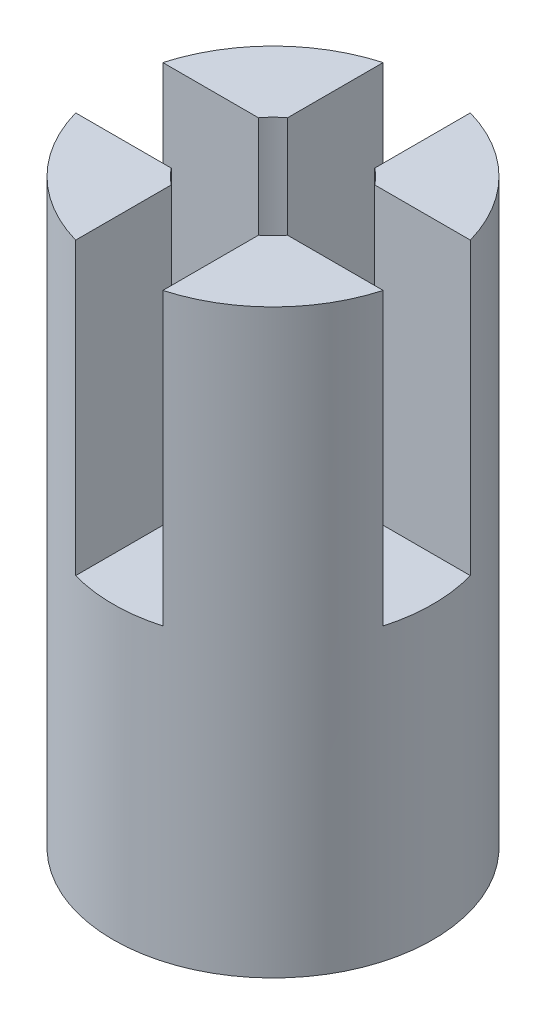
ISO-10303-21;
HEADER;
FILE_DESCRIPTION(('STEP AP214'),'2;1');
FILE_NAME('part.step','',(''),(''),'','','');
FILE_SCHEMA(('AUTOMOTIVE_DESIGN { 1 0 10303 214 1 1 1 1 }'));
ENDSEC;
DATA;
#1=APPLICATION_CONTEXT('core data for automotive mechanical design processes');
#2=APPLICATION_PROTOCOL_DEFINITION('international standard','automotive_design',2000,#1);
#3=PRODUCT_CONTEXT('',#1,'mechanical');
#4=PRODUCT('Part','Part','',(#3));
#5=PRODUCT_RELATED_PRODUCT_CATEGORY('part','',(#4));
#6=PRODUCT_DEFINITION_FORMATION('','',#4);
#7=PRODUCT_DEFINITION_CONTEXT('part definition',#1,'design');
#8=PRODUCT_DEFINITION('design','',#6,#7);
#9=PRODUCT_DEFINITION_SHAPE('','',#8);
#10=(LENGTH_UNIT() NAMED_UNIT(*) SI_UNIT(.MILLI.,.METRE.));
#11=(NAMED_UNIT(*) PLANE_ANGLE_UNIT() SI_UNIT($,.RADIAN.));
#12=(NAMED_UNIT(*) SI_UNIT($,.STERADIAN.) SOLID_ANGLE_UNIT());
#13=UNCERTAINTY_MEASURE_WITH_UNIT(LENGTH_MEASURE(1.E-05),#10,'distance_accuracy_value','');
#14=(GEOMETRIC_REPRESENTATION_CONTEXT(3) GLOBAL_UNCERTAINTY_ASSIGNED_CONTEXT((#13)) GLOBAL_UNIT_ASSIGNED_CONTEXT((#10,
#11,#12)) REPRESENTATION_CONTEXT('',''));
#15=CARTESIAN_POINT('',(0.,0.,0.));
#16=DIRECTION('',(0.,0.,1.));
#17=DIRECTION('',(1.,0.,0.));
#18=AXIS2_PLACEMENT_3D('',#15,#16,#17);
#19=CARTESIAN_POINT('',(0.,20.,0.));
#20=DIRECTION('',(0.,1.,0.));
#21=DIRECTION('',(0.,0.,1.));
#22=AXIS2_PLACEMENT_3D('',#19,#20,#21);
#23=PLANE('',#22);
#24=DIRECTION('',(0.,0.,-1.));
#25=VECTOR('',#24,1.);
#26=CARTESIAN_POINT('',(1.5,20.,-1.5));
#27=LINE('',#26,#25);
#28=CARTESIAN_POINT('',(1.5,20.,-2.));
#29=VERTEX_POINT('',#28);
#30=CARTESIAN_POINT('',(1.5,20.,-5.29150262212918));
#31=VERTEX_POINT('',#30);
#32=EDGE_CURVE('E231',#29,#31,#27,.T.);
#33=ORIENTED_EDGE('',*,*,#32,.F.);
#34=CARTESIAN_POINT('',(0.,20.,0.));
#35=DIRECTION('',(0.,1.,0.));
#36=DIRECTION('',(0.,0.,1.));
#37=AXIS2_PLACEMENT_3D('',#34,#35,#36);
#38=CIRCLE('',#37,2.5);
#39=CARTESIAN_POINT('',(2.,20.,-1.5));
#40=VERTEX_POINT('',#39);
#41=EDGE_CURVE('E279',#40,#29,#38,.T.);
#42=ORIENTED_EDGE('',*,*,#41,.F.);
#43=DIRECTION('',(-1.,0.,0.));
#44=VECTOR('',#43,1.);
#45=CARTESIAN_POINT('',(1.5,20.,-1.5));
#46=LINE('',#45,#44);
#47=CARTESIAN_POINT('',(5.29150262212918,20.,-1.5));
#48=VERTEX_POINT('',#47);
#49=EDGE_CURVE('E255',#48,#40,#46,.T.);
#50=ORIENTED_EDGE('',*,*,#49,.F.);
#51=CARTESIAN_POINT('',(0.,20.,0.));
#52=DIRECTION('',(0.,1.,0.));
#53=DIRECTION('',(0.,0.,1.));
#54=AXIS2_PLACEMENT_3D('',#51,#52,#53);
#55=CIRCLE('',#54,5.5);
#56=EDGE_CURVE('E169',#48,#31,#55,.T.);
#57=ORIENTED_EDGE('',*,*,#56,.T.);
#58=EDGE_LOOP('',(#33,#42,#50,#57));
#59=FACE_BOUND('',#58,.T.);
#60=ADVANCED_FACE('F33',(#59),#23,.T.);
#61=DIRECTION('',(1.,0.,0.));
#62=VECTOR('',#61,1.);
#63=CARTESIAN_POINT('',(1.5,20.,1.5));
#64=LINE('',#63,#62);
#65=CARTESIAN_POINT('',(2.,20.,1.5));
#66=VERTEX_POINT('',#65);
#67=CARTESIAN_POINT('',(5.29150262212918,20.,1.5));
#68=VERTEX_POINT('',#67);
#69=EDGE_CURVE('E253',#66,#68,#64,.T.);
#70=ORIENTED_EDGE('',*,*,#69,.F.);
#71=CARTESIAN_POINT('',(1.5,20.,2.));
#72=VERTEX_POINT('',#71);
#73=EDGE_CURVE('E184',#72,#66,#38,.T.);
#74=ORIENTED_EDGE('',*,*,#73,.F.);
#75=DIRECTION('',(0.,0.,-1.));
#76=VECTOR('',#75,1.);
#77=CARTESIAN_POINT('',(1.5,20.,5.79208174517747));
#78=LINE('',#77,#76);
#79=CARTESIAN_POINT('',(1.5,20.,5.29150262212918));
#80=VERTEX_POINT('',#79);
#81=EDGE_CURVE('E251',#80,#72,#78,.T.);
#82=ORIENTED_EDGE('',*,*,#81,.F.);
#83=EDGE_CURVE('E173',#80,#68,#55,.T.);
#84=ORIENTED_EDGE('',*,*,#83,.T.);
#85=EDGE_LOOP('',(#70,#74,#82,#84));
#86=FACE_BOUND('',#85,.T.);
#87=ADVANCED_FACE('F303',(#86),#23,.T.);
#88=DIRECTION('',(0.,0.,1.));
#89=VECTOR('',#88,1.);
#90=CARTESIAN_POINT('',(-1.5,20.,1.5));
#91=LINE('',#90,#89);
#92=CARTESIAN_POINT('',(-1.5,20.,2.));
#93=VERTEX_POINT('',#92);
#94=CARTESIAN_POINT('',(-1.5,20.,5.29150262212918));
#95=VERTEX_POINT('',#94);
#96=EDGE_CURVE('E249',#93,#95,#91,.T.);
#97=ORIENTED_EDGE('',*,*,#96,.F.);
#98=CARTESIAN_POINT('',(-2.,20.,1.5));
#99=VERTEX_POINT('',#98);
#100=EDGE_CURVE('E280',#99,#93,#38,.T.);
#101=ORIENTED_EDGE('',*,*,#100,.F.);
#102=DIRECTION('',(1.,0.,0.));
#103=VECTOR('',#102,1.);
#104=CARTESIAN_POINT('',(-9.18844745956285,20.,1.5));
#105=LINE('',#104,#103);
#106=CARTESIAN_POINT('',(-5.29150262212918,20.,1.5));
#107=VERTEX_POINT('',#106);
#108=EDGE_CURVE('E247',#107,#99,#105,.T.);
#109=ORIENTED_EDGE('',*,*,#108,.F.);
#110=EDGE_CURVE('E170',#107,#95,#55,.T.);
#111=ORIENTED_EDGE('',*,*,#110,.T.);
#112=EDGE_LOOP('',(#97,#101,#109,#111));
#113=FACE_BOUND('',#112,.T.);
#114=ADVANCED_FACE('F308',(#113),#23,.T.);
#115=DIRECTION('',(-1.,0.,0.));
#116=VECTOR('',#115,1.);
#117=CARTESIAN_POINT('',(-8.80863882053481,20.,-1.5));
#118=LINE('',#117,#116);
#119=CARTESIAN_POINT('',(-2.,20.,-1.5));
#120=VERTEX_POINT('',#119);
#121=CARTESIAN_POINT('',(-5.29150262212918,20.,-1.5));
#122=VERTEX_POINT('',#121);
#123=EDGE_CURVE('E163',#120,#122,#118,.T.);
#124=ORIENTED_EDGE('',*,*,#123,.F.);
#125=CARTESIAN_POINT('',(-1.5,20.,-2.));
#126=VERTEX_POINT('',#125);
#127=EDGE_CURVE('E162',#126,#120,#38,.T.);
#128=ORIENTED_EDGE('',*,*,#127,.F.);
#129=DIRECTION('',(0.,0.,1.));
#130=VECTOR('',#129,1.);
#131=CARTESIAN_POINT('',(-1.5,20.,-5.80668976975561));
#132=LINE('',#131,#130);
#133=CARTESIAN_POINT('',(-1.5,20.,-5.29150262212918));
#134=VERTEX_POINT('',#133);
#135=EDGE_CURVE('E147',#134,#126,#132,.T.);
#136=ORIENTED_EDGE('',*,*,#135,.F.);
#137=EDGE_CURVE('E160',#134,#122,#55,.T.);
#138=ORIENTED_EDGE('',*,*,#137,.T.);
#139=EDGE_LOOP('',(#124,#128,#136,#138));
#140=FACE_BOUND('',#139,.T.);
#141=ADVANCED_FACE('F159',(#140),#23,.T.);
#142=CARTESIAN_POINT('',(0.,0.,0.));
#143=DIRECTION('',(0.,1.,0.));
#144=DIRECTION('',(0.,0.,1.));
#145=AXIS2_PLACEMENT_3D('',#142,#143,#144);
#146=PLANE('',#145);
#147=CARTESIAN_POINT('',(0.,0.,0.));
#148=DIRECTION('',(0.,1.,0.));
#149=DIRECTION('',(0.,0.,1.));
#150=AXIS2_PLACEMENT_3D('',#147,#148,#149);
#151=CIRCLE('',#150,5.5);
#152=CARTESIAN_POINT('',(0.,0.,5.5));
#153=VERTEX_POINT('',#152);
#154=EDGE_CURVE('E175',#153,#153,#151,.T.);
#155=ORIENTED_EDGE('',*,*,#154,.F.);
#156=EDGE_LOOP('',(#155));
#157=FACE_BOUND('',#156,.T.);
#158=CARTESIAN_POINT('',(0.,0.,0.));
#159=DIRECTION('',(0.,1.,0.));
#160=DIRECTION('',(0.,0.,1.));
#161=AXIS2_PLACEMENT_3D('',#158,#159,#160);
#162=CIRCLE('',#161,2.5);
#163=CARTESIAN_POINT('',(0.,0.,2.5));
#164=VERTEX_POINT('',#163);
#165=EDGE_CURVE('E180',#164,#164,#162,.T.);
#166=ORIENTED_EDGE('',*,*,#165,.T.);
#167=EDGE_LOOP('',(#166));
#168=FACE_BOUND('',#167,.T.);
#169=ADVANCED_FACE('F288',(#157,#168),#146,.F.);
#170=CARTESIAN_POINT('',(0.,20.,0.));
#171=DIRECTION('',(0.,-1.,0.));
#172=DIRECTION('',(0.,0.,-1.));
#173=AXIS2_PLACEMENT_3D('',#170,#171,#172);
#174=CYLINDRICAL_SURFACE('',#173,5.5);
#175=ORIENTED_EDGE('',*,*,#56,.F.);
#176=DIRECTION('',(0.,-1.,0.));
#177=VECTOR('',#176,1.);
#178=CARTESIAN_POINT('',(5.29150262212918,20.,-1.5));
#179=LINE('',#178,#177);
#180=CARTESIAN_POINT('',(5.29150262212918,10.,-1.5));
#181=VERTEX_POINT('',#180);
#182=EDGE_CURVE('E273',#48,#181,#179,.T.);
#183=ORIENTED_EDGE('',*,*,#182,.T.);
#184=CARTESIAN_POINT('',(0.,10.,0.));
#185=DIRECTION('',(0.,1.,0.));
#186=DIRECTION('',(0.,0.,1.));
#187=AXIS2_PLACEMENT_3D('',#184,#185,#186);
#188=CIRCLE('',#187,5.5);
#189=CARTESIAN_POINT('',(5.29150262212918,10.,1.5));
#190=VERTEX_POINT('',#189);
#191=EDGE_CURVE('E153',#190,#181,#188,.T.);
#192=ORIENTED_EDGE('',*,*,#191,.F.);
#193=DIRECTION('',(0.,-1.,0.));
#194=VECTOR('',#193,1.);
#195=CARTESIAN_POINT('',(5.29150262212918,20.,1.5));
#196=LINE('',#195,#194);
#197=EDGE_CURVE('E270',#190,#68,#196,.F.);
#198=ORIENTED_EDGE('',*,*,#197,.T.);
#199=ORIENTED_EDGE('',*,*,#83,.F.);
#200=DIRECTION('',(0.,-1.,0.));
#201=VECTOR('',#200,1.);
#202=CARTESIAN_POINT('',(1.5,20.,5.29150262212918));
#203=LINE('',#202,#201);
#204=CARTESIAN_POINT('',(1.5,10.,5.29150262212918));
#205=VERTEX_POINT('',#204);
#206=EDGE_CURVE('E267',#80,#205,#203,.T.);
#207=ORIENTED_EDGE('',*,*,#206,.T.);
#208=CARTESIAN_POINT('',(-1.5,10.,5.29150262212918));
#209=VERTEX_POINT('',#208);
#210=EDGE_CURVE('E244',#209,#205,#188,.T.);
#211=ORIENTED_EDGE('',*,*,#210,.F.);
#212=DIRECTION('',(0.,-1.,0.));
#213=VECTOR('',#212,1.);
#214=CARTESIAN_POINT('',(-1.5,20.,5.29150262212918));
#215=LINE('',#214,#213);
#216=EDGE_CURVE('E264',#209,#95,#215,.F.);
#217=ORIENTED_EDGE('',*,*,#216,.T.);
#218=ORIENTED_EDGE('',*,*,#110,.F.);
#219=DIRECTION('',(0.,-1.,0.));
#220=VECTOR('',#219,1.);
#221=CARTESIAN_POINT('',(-5.29150262212918,20.,1.5));
#222=LINE('',#221,#220);
#223=CARTESIAN_POINT('',(-5.29150262212918,10.,1.5));
#224=VERTEX_POINT('',#223);
#225=EDGE_CURVE('E261',#107,#224,#222,.T.);
#226=ORIENTED_EDGE('',*,*,#225,.T.);
#227=CARTESIAN_POINT('',(-5.29150262212918,10.,-1.5));
#228=VERTEX_POINT('',#227);
#229=EDGE_CURVE('E258',#228,#224,#188,.T.);
#230=ORIENTED_EDGE('',*,*,#229,.F.);
#231=DIRECTION('',(0.,-1.,0.));
#232=VECTOR('',#231,1.);
#233=CARTESIAN_POINT('',(-5.29150262212918,20.,-1.5));
#234=LINE('',#233,#232);
#235=EDGE_CURVE('E152',#228,#122,#234,.F.);
#236=ORIENTED_EDGE('',*,*,#235,.T.);
#237=ORIENTED_EDGE('',*,*,#137,.F.);
#238=DIRECTION('',(0.,-1.,0.));
#239=VECTOR('',#238,1.);
#240=CARTESIAN_POINT('',(-1.5,20.,-5.29150262212918));
#241=LINE('',#240,#239);
#242=CARTESIAN_POINT('',(-1.5,10.,-5.29150262212918));
#243=VERTEX_POINT('',#242);
#244=EDGE_CURVE('E144',#134,#243,#241,.T.);
#245=ORIENTED_EDGE('',*,*,#244,.T.);
#246=CARTESIAN_POINT('',(1.5,10.,-5.29150262212918));
#247=VERTEX_POINT('',#246);
#248=EDGE_CURVE('E333',#247,#243,#188,.T.);
#249=ORIENTED_EDGE('',*,*,#248,.F.);
#250=DIRECTION('',(0.,-1.,0.));
#251=VECTOR('',#250,1.);
#252=CARTESIAN_POINT('',(1.5,20.,-5.29150262212918));
#253=LINE('',#252,#251);
#254=EDGE_CURVE('E276',#247,#31,#253,.F.);
#255=ORIENTED_EDGE('',*,*,#254,.T.);
#256=EDGE_LOOP('',(#175,#183,#192,#198,#199,#207,#211,#217,#218,#226,#230,#236,#237,#245,#249,#255));
#257=FACE_BOUND('',#256,.T.);
#258=ORIENTED_EDGE('',*,*,#154,.T.);
#259=EDGE_LOOP('',(#258));
#260=FACE_BOUND('',#259,.T.);
#261=ADVANCED_FACE('F35',(#257,#260),#174,.T.);
#262=CARTESIAN_POINT('',(0.,20.,0.));
#263=DIRECTION('',(0.,-1.,0.));
#264=DIRECTION('',(0.,0.,-1.));
#265=AXIS2_PLACEMENT_3D('',#262,#263,#264);
#266=CYLINDRICAL_SURFACE('',#265,2.5);
#267=DIRECTION('',(0.,-1.,0.));
#268=VECTOR('',#267,1.);
#269=CARTESIAN_POINT('',(2.,20.,-1.5));
#270=LINE('',#269,#268);
#271=CARTESIAN_POINT('',(2.,10.,-1.5));
#272=VERTEX_POINT('',#271);
#273=EDGE_CURVE('E11',#40,#272,#270,.T.);
#274=ORIENTED_EDGE('',*,*,#273,.F.);
#275=ORIENTED_EDGE('',*,*,#41,.T.);
#276=DIRECTION('',(0.,-1.,0.));
#277=VECTOR('',#276,1.);
#278=CARTESIAN_POINT('',(1.5,20.,-2.));
#279=LINE('',#278,#277);
#280=CARTESIAN_POINT('',(1.5,10.,-2.));
#281=VERTEX_POINT('',#280);
#282=EDGE_CURVE('E202',#281,#29,#279,.F.);
#283=ORIENTED_EDGE('',*,*,#282,.F.);
#284=CARTESIAN_POINT('',(0.,10.,0.));
#285=DIRECTION('',(0.,1.,0.));
#286=DIRECTION('',(0.,0.,1.));
#287=AXIS2_PLACEMENT_3D('',#284,#285,#286);
#288=CIRCLE('',#287,2.5);
#289=CARTESIAN_POINT('',(-1.5,10.,-2.));
#290=VERTEX_POINT('',#289);
#291=EDGE_CURVE('E199',#281,#290,#288,.T.);
#292=ORIENTED_EDGE('',*,*,#291,.T.);
#293=DIRECTION('',(0.,-1.,0.));
#294=VECTOR('',#293,1.);
#295=CARTESIAN_POINT('',(-1.5,20.,-2.));
#296=LINE('',#295,#294);
#297=EDGE_CURVE('E200',#126,#290,#296,.T.);
#298=ORIENTED_EDGE('',*,*,#297,.F.);
#299=ORIENTED_EDGE('',*,*,#127,.T.);
#300=DIRECTION('',(0.,-1.,0.));
#301=VECTOR('',#300,1.);
#302=CARTESIAN_POINT('',(-2.,20.,-1.5));
#303=LINE('',#302,#301);
#304=CARTESIAN_POINT('',(-2.,10.,-1.5));
#305=VERTEX_POINT('',#304);
#306=EDGE_CURVE('E194',#305,#120,#303,.F.);
#307=ORIENTED_EDGE('',*,*,#306,.F.);
#308=CARTESIAN_POINT('',(-2.,10.,1.5));
#309=VERTEX_POINT('',#308);
#310=EDGE_CURVE('E189',#305,#309,#288,.T.);
#311=ORIENTED_EDGE('',*,*,#310,.T.);
#312=DIRECTION('',(0.,-1.,0.));
#313=VECTOR('',#312,1.);
#314=CARTESIAN_POINT('',(-2.,20.,1.5));
#315=LINE('',#314,#313);
#316=EDGE_CURVE('E196',#99,#309,#315,.T.);
#317=ORIENTED_EDGE('',*,*,#316,.F.);
#318=ORIENTED_EDGE('',*,*,#100,.T.);
#319=DIRECTION('',(0.,-1.,0.));
#320=VECTOR('',#319,1.);
#321=CARTESIAN_POINT('',(-1.5,20.,2.));
#322=LINE('',#321,#320);
#323=CARTESIAN_POINT('',(-1.5,10.,2.));
#324=VERTEX_POINT('',#323);
#325=EDGE_CURVE('E187',#324,#93,#322,.F.);
#326=ORIENTED_EDGE('',*,*,#325,.F.);
#327=CARTESIAN_POINT('',(1.5,10.,2.));
#328=VERTEX_POINT('',#327);
#329=EDGE_CURVE('E179',#324,#328,#288,.T.);
#330=ORIENTED_EDGE('',*,*,#329,.T.);
#331=DIRECTION('',(0.,-1.,0.));
#332=VECTOR('',#331,1.);
#333=CARTESIAN_POINT('',(1.5,20.,2.));
#334=LINE('',#333,#332);
#335=EDGE_CURVE('E191',#72,#328,#334,.T.);
#336=ORIENTED_EDGE('',*,*,#335,.F.);
#337=ORIENTED_EDGE('',*,*,#73,.T.);
#338=DIRECTION('',(0.,-1.,0.));
#339=VECTOR('',#338,1.);
#340=CARTESIAN_POINT('',(2.,20.,1.5));
#341=LINE('',#340,#339);
#342=CARTESIAN_POINT('',(2.,10.,1.5));
#343=VERTEX_POINT('',#342);
#344=EDGE_CURVE('E41',#343,#66,#341,.F.);
#345=ORIENTED_EDGE('',*,*,#344,.F.);
#346=EDGE_CURVE('E188',#343,#272,#288,.T.);
#347=ORIENTED_EDGE('',*,*,#346,.T.);
#348=EDGE_LOOP('',(#274,#275,#283,#292,#298,#299,#307,#311,#317,#318,#326,#330,#336,#337,#345,#347));
#349=FACE_BOUND('',#348,.T.);
#350=ORIENTED_EDGE('',*,*,#165,.F.);
#351=EDGE_LOOP('',(#350));
#352=FACE_BOUND('',#351,.T.);
#353=ADVANCED_FACE('F215',(#349,#352),#266,.F.);
#354=CARTESIAN_POINT('',(0.,10.,0.));
#355=DIRECTION('',(0.,1.,0.));
#356=DIRECTION('',(0.,0.,1.));
#357=AXIS2_PLACEMENT_3D('',#354,#355,#356);
#358=PLANE('',#357);
#359=ORIENTED_EDGE('',*,*,#210,.T.);
#360=DIRECTION('',(0.,0.,-1.));
#361=VECTOR('',#360,1.);
#362=CARTESIAN_POINT('',(1.5,10.,5.79208174517747));
#363=LINE('',#362,#361);
#364=EDGE_CURVE('E236',#205,#328,#363,.T.);
#365=ORIENTED_EDGE('',*,*,#364,.T.);
#366=ORIENTED_EDGE('',*,*,#329,.F.);
#367=DIRECTION('',(0.,0.,1.));
#368=VECTOR('',#367,1.);
#369=CARTESIAN_POINT('',(-1.5,10.,1.5));
#370=LINE('',#369,#368);
#371=EDGE_CURVE('E229',#324,#209,#370,.T.);
#372=ORIENTED_EDGE('',*,*,#371,.T.);
#373=EDGE_LOOP('',(#359,#365,#366,#372));
#374=FACE_BOUND('',#373,.T.);
#375=ADVANCED_FACE('F290',(#374),#358,.T.);
#376=CARTESIAN_POINT('',(-1.5,10.,1.5));
#377=DIRECTION('',(-1.,0.,0.));
#378=DIRECTION('',(0.,0.,1.));
#379=AXIS2_PLACEMENT_3D('',#376,#377,#378);
#380=PLANE('',#379);
#381=ORIENTED_EDGE('',*,*,#371,.F.);
#382=ORIENTED_EDGE('',*,*,#325,.T.);
#383=ORIENTED_EDGE('',*,*,#96,.T.);
#384=ORIENTED_EDGE('',*,*,#216,.F.);
#385=EDGE_LOOP('',(#381,#382,#383,#384));
#386=FACE_BOUND('',#385,.T.);
#387=ADVANCED_FACE('F296',(#386),#380,.F.);
#388=CARTESIAN_POINT('',(1.5,10.,5.79208174517747));
#389=DIRECTION('',(1.,0.,0.));
#390=DIRECTION('',(0.,0.,-1.));
#391=AXIS2_PLACEMENT_3D('',#388,#389,#390);
#392=PLANE('',#391);
#393=ORIENTED_EDGE('',*,*,#81,.T.);
#394=ORIENTED_EDGE('',*,*,#335,.T.);
#395=ORIENTED_EDGE('',*,*,#364,.F.);
#396=ORIENTED_EDGE('',*,*,#206,.F.);
#397=EDGE_LOOP('',(#393,#394,#395,#396));
#398=FACE_BOUND('',#397,.T.);
#399=ADVANCED_FACE('F329',(#398),#392,.F.);
#400=ORIENTED_EDGE('',*,*,#229,.T.);
#401=DIRECTION('',(1.,0.,0.));
#402=VECTOR('',#401,1.);
#403=CARTESIAN_POINT('',(-9.18844745956285,10.,1.5));
#404=LINE('',#403,#402);
#405=EDGE_CURVE('E225',#224,#309,#404,.T.);
#406=ORIENTED_EDGE('',*,*,#405,.T.);
#407=ORIENTED_EDGE('',*,*,#310,.F.);
#408=DIRECTION('',(-1.,0.,0.));
#409=VECTOR('',#408,1.);
#410=CARTESIAN_POINT('',(-8.80863882053481,10.,-1.5));
#411=LINE('',#410,#409);
#412=EDGE_CURVE('E223',#305,#228,#411,.T.);
#413=ORIENTED_EDGE('',*,*,#412,.T.);
#414=EDGE_LOOP('',(#400,#406,#407,#413));
#415=FACE_BOUND('',#414,.T.);
#416=ADVANCED_FACE('F222',(#415),#358,.T.);
#417=CARTESIAN_POINT('',(-8.80863882053481,10.,-1.5));
#418=DIRECTION('',(0.,0.,-1.));
#419=DIRECTION('',(-1.,0.,0.));
#420=AXIS2_PLACEMENT_3D('',#417,#418,#419);
#421=PLANE('',#420);
#422=ORIENTED_EDGE('',*,*,#412,.F.);
#423=ORIENTED_EDGE('',*,*,#306,.T.);
#424=ORIENTED_EDGE('',*,*,#123,.T.);
#425=ORIENTED_EDGE('',*,*,#235,.F.);
#426=EDGE_LOOP('',(#422,#423,#424,#425));
#427=FACE_BOUND('',#426,.T.);
#428=ADVANCED_FACE('F227',(#427),#421,.F.);
#429=CARTESIAN_POINT('',(-9.18844745956285,10.,1.5));
#430=DIRECTION('',(0.,0.,1.));
#431=DIRECTION('',(1.,0.,0.));
#432=AXIS2_PLACEMENT_3D('',#429,#430,#431);
#433=PLANE('',#432);
#434=ORIENTED_EDGE('',*,*,#108,.T.);
#435=ORIENTED_EDGE('',*,*,#316,.T.);
#436=ORIENTED_EDGE('',*,*,#405,.F.);
#437=ORIENTED_EDGE('',*,*,#225,.F.);
#438=EDGE_LOOP('',(#434,#435,#436,#437));
#439=FACE_BOUND('',#438,.T.);
#440=ADVANCED_FACE('F335',(#439),#433,.F.);
#441=ORIENTED_EDGE('',*,*,#248,.T.);
#442=DIRECTION('',(0.,0.,1.));
#443=VECTOR('',#442,1.);
#444=CARTESIAN_POINT('',(-1.5,10.,-5.80668976975561));
#445=LINE('',#444,#443);
#446=EDGE_CURVE('E55',#243,#290,#445,.T.);
#447=ORIENTED_EDGE('',*,*,#446,.T.);
#448=ORIENTED_EDGE('',*,*,#291,.F.);
#449=DIRECTION('',(0.,0.,-1.));
#450=VECTOR('',#449,1.);
#451=CARTESIAN_POINT('',(1.5,10.,-1.5));
#452=LINE('',#451,#450);
#453=EDGE_CURVE('E242',#281,#247,#452,.T.);
#454=ORIENTED_EDGE('',*,*,#453,.T.);
#455=EDGE_LOOP('',(#441,#447,#448,#454));
#456=FACE_BOUND('',#455,.T.);
#457=ADVANCED_FACE('F337',(#456),#358,.T.);
#458=CARTESIAN_POINT('',(-1.5,10.,-5.80668976975561));
#459=DIRECTION('',(-1.,0.,0.));
#460=DIRECTION('',(0.,0.,1.));
#461=AXIS2_PLACEMENT_3D('',#458,#459,#460);
#462=PLANE('',#461);
#463=ORIENTED_EDGE('',*,*,#135,.T.);
#464=ORIENTED_EDGE('',*,*,#297,.T.);
#465=ORIENTED_EDGE('',*,*,#446,.F.);
#466=ORIENTED_EDGE('',*,*,#244,.F.);
#467=EDGE_LOOP('',(#463,#464,#465,#466));
#468=FACE_BOUND('',#467,.T.);
#469=ADVANCED_FACE('F146',(#468),#462,.F.);
#470=CARTESIAN_POINT('',(1.5,10.,-1.5));
#471=DIRECTION('',(1.,0.,0.));
#472=DIRECTION('',(0.,0.,-1.));
#473=AXIS2_PLACEMENT_3D('',#470,#471,#472);
#474=PLANE('',#473);
#475=ORIENTED_EDGE('',*,*,#453,.F.);
#476=ORIENTED_EDGE('',*,*,#282,.T.);
#477=ORIENTED_EDGE('',*,*,#32,.T.);
#478=ORIENTED_EDGE('',*,*,#254,.F.);
#479=EDGE_LOOP('',(#475,#476,#477,#478));
#480=FACE_BOUND('',#479,.T.);
#481=ADVANCED_FACE('F347',(#480),#474,.F.);
#482=CARTESIAN_POINT('',(1.5,10.,-1.5));
#483=DIRECTION('',(0.,0.,-1.));
#484=DIRECTION('',(-1.,0.,0.));
#485=AXIS2_PLACEMENT_3D('',#482,#483,#484);
#486=PLANE('',#485);
#487=ORIENTED_EDGE('',*,*,#49,.T.);
#488=ORIENTED_EDGE('',*,*,#273,.T.);
#489=DIRECTION('',(-1.,0.,0.));
#490=VECTOR('',#489,1.);
#491=CARTESIAN_POINT('',(1.5,10.,-1.5));
#492=LINE('',#491,#490);
#493=EDGE_CURVE('E48',#181,#272,#492,.T.);
#494=ORIENTED_EDGE('',*,*,#493,.F.);
#495=ORIENTED_EDGE('',*,*,#182,.F.);
#496=EDGE_LOOP('',(#487,#488,#494,#495));
#497=FACE_BOUND('',#496,.T.);
#498=ADVANCED_FACE('F351',(#497),#486,.F.);
#499=CARTESIAN_POINT('',(1.5,10.,1.5));
#500=DIRECTION('',(0.,0.,1.));
#501=DIRECTION('',(1.,0.,0.));
#502=AXIS2_PLACEMENT_3D('',#499,#500,#501);
#503=PLANE('',#502);
#504=DIRECTION('',(1.,0.,0.));
#505=VECTOR('',#504,1.);
#506=CARTESIAN_POINT('',(1.5,10.,1.5));
#507=LINE('',#506,#505);
#508=EDGE_CURVE('E238',#343,#190,#507,.T.);
#509=ORIENTED_EDGE('',*,*,#508,.F.);
#510=ORIENTED_EDGE('',*,*,#344,.T.);
#511=ORIENTED_EDGE('',*,*,#69,.T.);
#512=ORIENTED_EDGE('',*,*,#197,.F.);
#513=EDGE_LOOP('',(#509,#510,#511,#512));
#514=FACE_BOUND('',#513,.T.);
#515=ADVANCED_FACE('F331',(#514),#503,.F.);
#516=ORIENTED_EDGE('',*,*,#191,.T.);
#517=ORIENTED_EDGE('',*,*,#493,.T.);
#518=ORIENTED_EDGE('',*,*,#346,.F.);
#519=ORIENTED_EDGE('',*,*,#508,.T.);
#520=EDGE_LOOP('',(#516,#517,#518,#519));
#521=FACE_BOUND('',#520,.T.);
#522=ADVANCED_FACE('F299',(#521),#358,.T.);
#523=CLOSED_SHELL('',(#60,#87,#114,#141,#169,#261,#353,#375,#387,#399,#416,#428,#440,#457,#469,
#481,#498,#515,#522));
#524=MANIFOLD_SOLID_BREP('B2',#523);
#525=ADVANCED_BREP_SHAPE_REPRESENTATION('',(#18,#524),#14);
#526=SHAPE_DEFINITION_REPRESENTATION(#9,#525);
ENDSEC;
END-ISO-10303-21;
